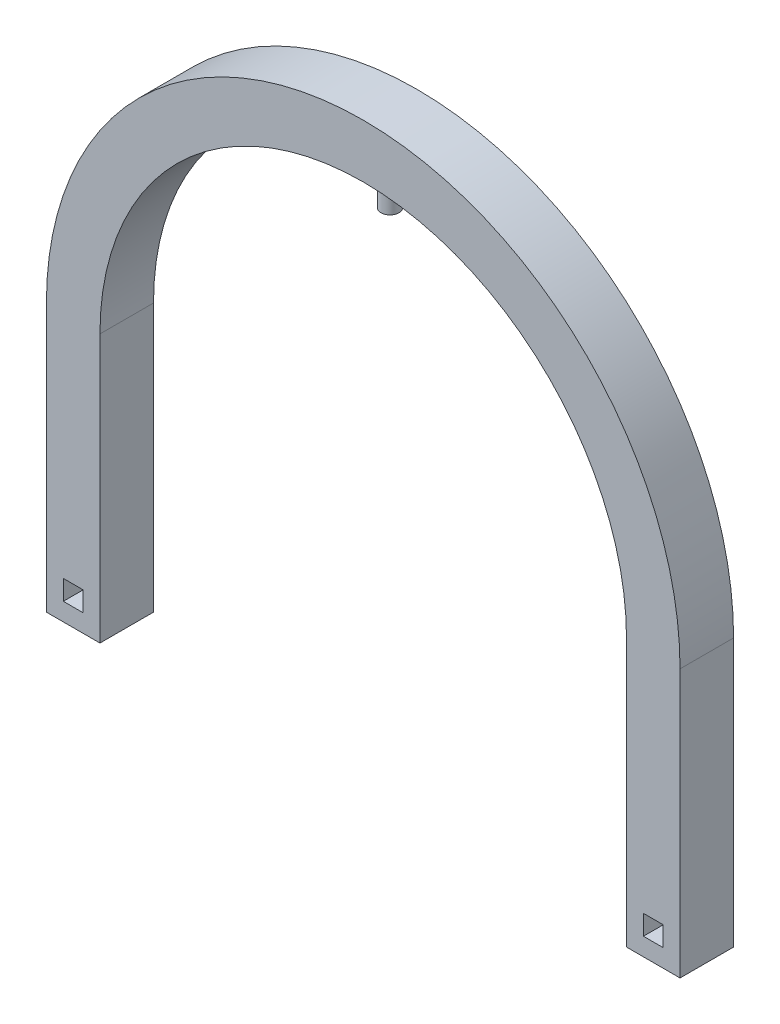
ISO-10303-21;
HEADER;
FILE_DESCRIPTION(('STEP AP214'),'2;1');
FILE_NAME('part.step','',(''),(''),'','','');
FILE_SCHEMA(('AUTOMOTIVE_DESIGN { 1 0 10303 214 1 1 1 1 }'));
ENDSEC;
DATA;
#1=APPLICATION_CONTEXT('core data for automotive mechanical design processes');
#2=APPLICATION_PROTOCOL_DEFINITION('international standard','automotive_design',2000,#1);
#3=PRODUCT_CONTEXT('',#1,'mechanical');
#4=PRODUCT('Part','Part','',(#3));
#5=PRODUCT_RELATED_PRODUCT_CATEGORY('part','',(#4));
#6=PRODUCT_DEFINITION_FORMATION('','',#4);
#7=PRODUCT_DEFINITION_CONTEXT('part definition',#1,'design');
#8=PRODUCT_DEFINITION('design','',#6,#7);
#9=PRODUCT_DEFINITION_SHAPE('','',#8);
#10=(LENGTH_UNIT() NAMED_UNIT(*) SI_UNIT(.MILLI.,.METRE.));
#11=(NAMED_UNIT(*) PLANE_ANGLE_UNIT() SI_UNIT($,.RADIAN.));
#12=(NAMED_UNIT(*) SI_UNIT($,.STERADIAN.) SOLID_ANGLE_UNIT());
#13=UNCERTAINTY_MEASURE_WITH_UNIT(LENGTH_MEASURE(1.E-05),#10,'distance_accuracy_value','');
#14=(GEOMETRIC_REPRESENTATION_CONTEXT(3) GLOBAL_UNCERTAINTY_ASSIGNED_CONTEXT((#13)) GLOBAL_UNIT_ASSIGNED_CONTEXT((#10,
#11,#12)) REPRESENTATION_CONTEXT('',''));
#15=CARTESIAN_POINT('',(0.,0.,0.));
#16=DIRECTION('',(0.,0.,1.));
#17=DIRECTION('',(1.,0.,0.));
#18=AXIS2_PLACEMENT_3D('',#15,#16,#17);
#19=CARTESIAN_POINT('',(-38.1,381.,-38.1));
#20=DIRECTION('',(0.,0.,1.));
#21=DIRECTION('',(1.,0.,0.));
#22=AXIS2_PLACEMENT_3D('',#19,#20,#21);
#23=PLANE('',#22);
#24=DIRECTION('',(-1.,0.,0.));
#25=VECTOR('',#24,1.);
#26=CARTESIAN_POINT('',(-38.1,0.,-38.1));
#27=LINE('',#26,#25);
#28=CARTESIAN_POINT('',(38.1,0.,-38.1));
#29=VERTEX_POINT('',#28);
#30=CARTESIAN_POINT('',(-38.1,0.,-38.1));
#31=VERTEX_POINT('',#30);
#32=EDGE_CURVE('E274',#29,#31,#27,.T.);
#33=ORIENTED_EDGE('',*,*,#32,.T.);
#34=DIRECTION('',(0.,-1.,0.));
#35=VECTOR('',#34,1.);
#36=CARTESIAN_POINT('',(-38.1,381.,-38.1));
#37=LINE('',#36,#35);
#38=CARTESIAN_POINT('',(-38.1,381.,-38.1));
#39=VERTEX_POINT('',#38);
#40=EDGE_CURVE('E281',#39,#31,#37,.T.);
#41=ORIENTED_EDGE('',*,*,#40,.F.);
#42=CARTESIAN_POINT('',(-412.75,381.,-38.1));
#43=DIRECTION('',(0.,0.,-1.));
#44=DIRECTION('',(1.,0.,0.));
#45=AXIS2_PLACEMENT_3D('',#42,#43,#44);
#46=CIRCLE('',#45,374.65);
#47=CARTESIAN_POINT('',(-787.4,381.,-38.1));
#48=VERTEX_POINT('',#47);
#49=EDGE_CURVE('E219',#48,#39,#46,.T.);
#50=ORIENTED_EDGE('',*,*,#49,.F.);
#51=DIRECTION('',(0.,-1.,0.));
#52=VECTOR('',#51,1.);
#53=CARTESIAN_POINT('',(-787.4,381.,-38.1));
#54=LINE('',#53,#52);
#55=CARTESIAN_POINT('',(-787.4,0.,-38.1));
#56=VERTEX_POINT('',#55);
#57=EDGE_CURVE('E197',#48,#56,#54,.T.);
#58=ORIENTED_EDGE('',*,*,#57,.T.);
#59=DIRECTION('',(-1.,0.,0.));
#60=VECTOR('',#59,1.);
#61=CARTESIAN_POINT('',(-863.6,0.,-38.1));
#62=LINE('',#61,#60);
#63=CARTESIAN_POINT('',(-863.6,0.,-38.1));
#64=VERTEX_POINT('',#63);
#65=EDGE_CURVE('E214',#56,#64,#62,.T.);
#66=ORIENTED_EDGE('',*,*,#65,.T.);
#67=DIRECTION('',(0.,-1.,0.));
#68=VECTOR('',#67,1.);
#69=CARTESIAN_POINT('',(-863.6,381.,-38.1));
#70=LINE('',#69,#68);
#71=CARTESIAN_POINT('',(-863.6,381.,-38.1));
#72=VERTEX_POINT('',#71);
#73=EDGE_CURVE('E205',#72,#64,#70,.T.);
#74=ORIENTED_EDGE('',*,*,#73,.F.);
#75=CARTESIAN_POINT('',(-412.75,381.,-38.1));
#76=DIRECTION('',(0.,0.,1.));
#77=DIRECTION('',(1.,0.,0.));
#78=AXIS2_PLACEMENT_3D('',#75,#76,#77);
#79=CIRCLE('',#78,450.85);
#80=CARTESIAN_POINT('',(38.1,381.,-38.1));
#81=VERTEX_POINT('',#80);
#82=EDGE_CURVE('E224',#81,#72,#79,.T.);
#83=ORIENTED_EDGE('',*,*,#82,.F.);
#84=DIRECTION('',(0.,-1.,0.));
#85=VECTOR('',#84,1.);
#86=CARTESIAN_POINT('',(38.1,381.,-38.1));
#87=LINE('',#86,#85);
#88=EDGE_CURVE('E55',#81,#29,#87,.T.);
#89=ORIENTED_EDGE('',*,*,#88,.T.);
#90=EDGE_LOOP('',(#33,#41,#50,#58,#66,#74,#83,#89));
#91=FACE_BOUND('',#90,.T.);
#92=DIRECTION('',(0.,-1.,0.));
#93=VECTOR('',#92,1.);
#94=CARTESIAN_POINT('',(14.0236283067812,0.,-38.1));
#95=LINE('',#94,#93);
#96=CARTESIAN_POINT('',(14.0236283067812,53.645033948252,-38.1));
#97=VERTEX_POINT('',#96);
#98=CARTESIAN_POINT('',(14.0236283067812,25.4,-38.1));
#99=VERTEX_POINT('',#98);
#100=EDGE_CURVE('E248',#97,#99,#95,.T.);
#101=ORIENTED_EDGE('',*,*,#100,.F.);
#102=DIRECTION('',(1.,0.,0.));
#103=VECTOR('',#102,1.);
#104=CARTESIAN_POINT('',(0.,53.645033948252,-38.1));
#105=LINE('',#104,#103);
#106=CARTESIAN_POINT('',(-14.0236283067813,53.645033948252,-38.1));
#107=VERTEX_POINT('',#106);
#108=EDGE_CURVE('E246',#107,#97,#105,.T.);
#109=ORIENTED_EDGE('',*,*,#108,.F.);
#110=DIRECTION('',(0.,-1.,0.));
#111=VECTOR('',#110,1.);
#112=CARTESIAN_POINT('',(-14.0236283067815,0.,-38.1));
#113=LINE('',#112,#111);
#114=CARTESIAN_POINT('',(-14.0236283067814,25.4,-38.1));
#115=VERTEX_POINT('',#114);
#116=EDGE_CURVE('E56',#107,#115,#113,.T.);
#117=ORIENTED_EDGE('',*,*,#116,.T.);
#118=DIRECTION('',(1.,0.,0.));
#119=VECTOR('',#118,1.);
#120=CARTESIAN_POINT('',(0.,25.4,-38.1));
#121=LINE('',#120,#119);
#122=EDGE_CURVE('E251',#115,#99,#121,.T.);
#123=ORIENTED_EDGE('',*,*,#122,.T.);
#124=EDGE_LOOP('',(#101,#109,#117,#123));
#125=FACE_BOUND('',#124,.T.);
#126=DIRECTION('',(0.,-1.,0.));
#127=VECTOR('',#126,1.);
#128=CARTESIAN_POINT('',(-811.476371693219,0.,-38.1));
#129=LINE('',#128,#127);
#130=CARTESIAN_POINT('',(-811.476371693219,53.645033948252,-38.1));
#131=VERTEX_POINT('',#130);
#132=CARTESIAN_POINT('',(-811.476371693219,25.4,-38.1));
#133=VERTEX_POINT('',#132);
#134=EDGE_CURVE('E183',#131,#133,#129,.T.);
#135=ORIENTED_EDGE('',*,*,#134,.F.);
#136=DIRECTION('',(-1.,0.,0.));
#137=VECTOR('',#136,1.);
#138=CARTESIAN_POINT('',(0.,53.645033948252,-38.1));
#139=LINE('',#138,#137);
#140=CARTESIAN_POINT('',(-839.523628306781,53.645033948252,-38.1));
#141=VERTEX_POINT('',#140);
#142=EDGE_CURVE('E186',#131,#141,#139,.T.);
#143=ORIENTED_EDGE('',*,*,#142,.T.);
#144=DIRECTION('',(0.,-1.,0.));
#145=VECTOR('',#144,1.);
#146=CARTESIAN_POINT('',(-839.523628306781,3.29990207684181E-12,-38.1));
#147=LINE('',#146,#145);
#148=CARTESIAN_POINT('',(-839.523628306781,25.4,-38.1));
#149=VERTEX_POINT('',#148);
#150=EDGE_CURVE('E167',#141,#149,#147,.T.);
#151=ORIENTED_EDGE('',*,*,#150,.T.);
#152=DIRECTION('',(-1.,0.,0.));
#153=VECTOR('',#152,1.);
#154=CARTESIAN_POINT('',(0.,25.4,-38.1));
#155=LINE('',#154,#153);
#156=EDGE_CURVE('E193',#133,#149,#155,.T.);
#157=ORIENTED_EDGE('',*,*,#156,.F.);
#158=EDGE_LOOP('',(#135,#143,#151,#157));
#159=FACE_BOUND('',#158,.T.);
#160=ADVANCED_FACE('F39',(#91,#125,#159),#23,.F.);
#161=CARTESIAN_POINT('',(-38.1,381.,38.1));
#162=DIRECTION('',(0.,0.,-1.));
#163=DIRECTION('',(-1.,0.,0.));
#164=AXIS2_PLACEMENT_3D('',#161,#162,#163);
#165=PLANE('',#164);
#166=DIRECTION('',(1.,0.,0.));
#167=VECTOR('',#166,1.);
#168=CARTESIAN_POINT('',(-38.1,0.,38.1));
#169=LINE('',#168,#167);
#170=CARTESIAN_POINT('',(-38.1,0.,38.1));
#171=VERTEX_POINT('',#170);
#172=CARTESIAN_POINT('',(38.1,0.,38.1));
#173=VERTEX_POINT('',#172);
#174=EDGE_CURVE('E267',#171,#173,#169,.T.);
#175=ORIENTED_EDGE('',*,*,#174,.T.);
#176=DIRECTION('',(0.,-1.,0.));
#177=VECTOR('',#176,1.);
#178=CARTESIAN_POINT('',(38.1,381.,38.1));
#179=LINE('',#178,#177);
#180=CARTESIAN_POINT('',(38.1,381.,38.1));
#181=VERTEX_POINT('',#180);
#182=EDGE_CURVE('E275',#181,#173,#179,.T.);
#183=ORIENTED_EDGE('',*,*,#182,.F.);
#184=CARTESIAN_POINT('',(-412.75,381.,38.1));
#185=DIRECTION('',(0.,0.,1.));
#186=DIRECTION('',(1.,0.,0.));
#187=AXIS2_PLACEMENT_3D('',#184,#185,#186);
#188=CIRCLE('',#187,450.85);
#189=CARTESIAN_POINT('',(-863.6,381.,38.1));
#190=VERTEX_POINT('',#189);
#191=EDGE_CURVE('E229',#181,#190,#188,.T.);
#192=ORIENTED_EDGE('',*,*,#191,.T.);
#193=DIRECTION('',(0.,-1.,0.));
#194=VECTOR('',#193,1.);
#195=CARTESIAN_POINT('',(-863.6,381.,38.1));
#196=LINE('',#195,#194);
#197=CARTESIAN_POINT('',(-863.6,0.,38.1));
#198=VERTEX_POINT('',#197);
#199=EDGE_CURVE('E202',#190,#198,#196,.T.);
#200=ORIENTED_EDGE('',*,*,#199,.T.);
#201=DIRECTION('',(1.,0.,0.));
#202=VECTOR('',#201,1.);
#203=CARTESIAN_POINT('',(-863.6,0.,38.1));
#204=LINE('',#203,#202);
#205=CARTESIAN_POINT('',(-787.4,0.,38.1));
#206=VERTEX_POINT('',#205);
#207=EDGE_CURVE('E211',#198,#206,#204,.T.);
#208=ORIENTED_EDGE('',*,*,#207,.T.);
#209=DIRECTION('',(0.,-1.,0.));
#210=VECTOR('',#209,1.);
#211=CARTESIAN_POINT('',(-787.4,381.,38.1));
#212=LINE('',#211,#210);
#213=CARTESIAN_POINT('',(-787.4,381.,38.1));
#214=VERTEX_POINT('',#213);
#215=EDGE_CURVE('E208',#214,#206,#212,.T.);
#216=ORIENTED_EDGE('',*,*,#215,.F.);
#217=CARTESIAN_POINT('',(-412.75,381.,38.1));
#218=DIRECTION('',(0.,0.,-1.));
#219=DIRECTION('',(1.,0.,0.));
#220=AXIS2_PLACEMENT_3D('',#217,#218,#219);
#221=CIRCLE('',#220,374.65);
#222=CARTESIAN_POINT('',(-38.1,381.,38.1));
#223=VERTEX_POINT('',#222);
#224=EDGE_CURVE('E227',#214,#223,#221,.T.);
#225=ORIENTED_EDGE('',*,*,#224,.T.);
#226=DIRECTION('',(0.,-1.,0.));
#227=VECTOR('',#226,1.);
#228=CARTESIAN_POINT('',(-38.1,381.,38.1));
#229=LINE('',#228,#227);
#230=EDGE_CURVE('E285',#223,#171,#229,.T.);
#231=ORIENTED_EDGE('',*,*,#230,.T.);
#232=EDGE_LOOP('',(#175,#183,#192,#200,#208,#216,#225,#231));
#233=FACE_BOUND('',#232,.T.);
#234=DIRECTION('',(0.,-1.,0.));
#235=VECTOR('',#234,1.);
#236=CARTESIAN_POINT('',(14.0236283067812,0.,38.1));
#237=LINE('',#236,#235);
#238=CARTESIAN_POINT('',(14.0236283067812,53.645033948252,38.1));
#239=VERTEX_POINT('',#238);
#240=CARTESIAN_POINT('',(14.0236283067812,25.4,38.1));
#241=VERTEX_POINT('',#240);
#242=EDGE_CURVE('E70',#239,#241,#237,.T.);
#243=ORIENTED_EDGE('',*,*,#242,.T.);
#244=DIRECTION('',(1.,0.,0.));
#245=VECTOR('',#244,1.);
#246=CARTESIAN_POINT('',(0.,25.4,38.1));
#247=LINE('',#246,#245);
#248=CARTESIAN_POINT('',(-14.0236283067814,25.4,38.1));
#249=VERTEX_POINT('',#248);
#250=EDGE_CURVE('E241',#249,#241,#247,.T.);
#251=ORIENTED_EDGE('',*,*,#250,.F.);
#252=DIRECTION('',(0.,-1.,0.));
#253=VECTOR('',#252,1.);
#254=CARTESIAN_POINT('',(-14.0236283067815,0.,38.1));
#255=LINE('',#254,#253);
#256=CARTESIAN_POINT('',(-14.0236283067813,53.645033948252,38.1));
#257=VERTEX_POINT('',#256);
#258=EDGE_CURVE('E245',#257,#249,#255,.T.);
#259=ORIENTED_EDGE('',*,*,#258,.F.);
#260=DIRECTION('',(1.,0.,0.));
#261=VECTOR('',#260,1.);
#262=CARTESIAN_POINT('',(0.,53.645033948252,38.1));
#263=LINE('',#262,#261);
#264=EDGE_CURVE('E239',#257,#239,#263,.T.);
#265=ORIENTED_EDGE('',*,*,#264,.T.);
#266=EDGE_LOOP('',(#243,#251,#259,#265));
#267=FACE_BOUND('',#266,.T.);
#268=DIRECTION('',(0.,-1.,0.));
#269=VECTOR('',#268,1.);
#270=CARTESIAN_POINT('',(-811.476371693219,0.,38.1));
#271=LINE('',#270,#269);
#272=CARTESIAN_POINT('',(-811.476371693219,53.645033948252,38.1));
#273=VERTEX_POINT('',#272);
#274=CARTESIAN_POINT('',(-811.476371693219,25.4,38.1));
#275=VERTEX_POINT('',#274);
#276=EDGE_CURVE('E179',#273,#275,#271,.T.);
#277=ORIENTED_EDGE('',*,*,#276,.T.);
#278=DIRECTION('',(-1.,0.,0.));
#279=VECTOR('',#278,1.);
#280=CARTESIAN_POINT('',(0.,25.4,38.1));
#281=LINE('',#280,#279);
#282=CARTESIAN_POINT('',(-839.523628306781,25.4,38.1));
#283=VERTEX_POINT('',#282);
#284=EDGE_CURVE('E181',#275,#283,#281,.T.);
#285=ORIENTED_EDGE('',*,*,#284,.T.);
#286=DIRECTION('',(0.,-1.,0.));
#287=VECTOR('',#286,1.);
#288=CARTESIAN_POINT('',(-839.523628306781,3.29990207684181E-12,38.1));
#289=LINE('',#288,#287);
#290=CARTESIAN_POINT('',(-839.523628306781,53.645033948252,38.1));
#291=VERTEX_POINT('',#290);
#292=EDGE_CURVE('E162',#291,#283,#289,.T.);
#293=ORIENTED_EDGE('',*,*,#292,.F.);
#294=DIRECTION('',(-1.,0.,0.));
#295=VECTOR('',#294,1.);
#296=CARTESIAN_POINT('',(0.,53.645033948252,38.1));
#297=LINE('',#296,#295);
#298=EDGE_CURVE('E171',#273,#291,#297,.T.);
#299=ORIENTED_EDGE('',*,*,#298,.F.);
#300=EDGE_LOOP('',(#277,#285,#293,#299));
#301=FACE_BOUND('',#300,.T.);
#302=ADVANCED_FACE('F182',(#233,#267,#301),#165,.F.);
#303=CARTESIAN_POINT('',(38.1,381.,-38.1));
#304=DIRECTION('',(-1.,0.,0.));
#305=DIRECTION('',(0.,0.,1.));
#306=AXIS2_PLACEMENT_3D('',#303,#304,#305);
#307=PLANE('',#306);
#308=DIRECTION('',(0.,0.,-1.));
#309=VECTOR('',#308,1.);
#310=CARTESIAN_POINT('',(38.1,0.,-38.1));
#311=LINE('',#310,#309);
#312=EDGE_CURVE('E259',#173,#29,#311,.T.);
#313=ORIENTED_EDGE('',*,*,#312,.T.);
#314=ORIENTED_EDGE('',*,*,#88,.F.);
#315=DIRECTION('',(0.,0.,-1.));
#316=VECTOR('',#315,1.);
#317=CARTESIAN_POINT('',(38.1,381.,-38.1));
#318=LINE('',#317,#316);
#319=EDGE_CURVE('E264',#181,#81,#318,.T.);
#320=ORIENTED_EDGE('',*,*,#319,.F.);
#321=ORIENTED_EDGE('',*,*,#182,.T.);
#322=EDGE_LOOP('',(#313,#314,#320,#321));
#323=FACE_BOUND('',#322,.T.);
#324=ADVANCED_FACE('F41',(#323),#307,.F.);
#325=CARTESIAN_POINT('',(-38.1,381.,-38.1));
#326=DIRECTION('',(1.,0.,0.));
#327=DIRECTION('',(0.,0.,-1.));
#328=AXIS2_PLACEMENT_3D('',#325,#326,#327);
#329=PLANE('',#328);
#330=DIRECTION('',(0.,0.,1.));
#331=VECTOR('',#330,1.);
#332=CARTESIAN_POINT('',(-38.1,0.,-38.1));
#333=LINE('',#332,#331);
#334=EDGE_CURVE('E280',#31,#171,#333,.T.);
#335=ORIENTED_EDGE('',*,*,#334,.T.);
#336=ORIENTED_EDGE('',*,*,#230,.F.);
#337=DIRECTION('',(0.,0.,1.));
#338=VECTOR('',#337,1.);
#339=CARTESIAN_POINT('',(-38.1,381.,-38.1));
#340=LINE('',#339,#338);
#341=EDGE_CURVE('E268',#39,#223,#340,.T.);
#342=ORIENTED_EDGE('',*,*,#341,.F.);
#343=ORIENTED_EDGE('',*,*,#40,.T.);
#344=EDGE_LOOP('',(#335,#336,#342,#343));
#345=FACE_BOUND('',#344,.T.);
#346=ADVANCED_FACE('F299',(#345),#329,.F.);
#347=CARTESIAN_POINT('',(0.,0.,0.));
#348=DIRECTION('',(0.,1.,0.));
#349=DIRECTION('',(0.,0.,1.));
#350=AXIS2_PLACEMENT_3D('',#347,#348,#349);
#351=PLANE('',#350);
#352=ORIENTED_EDGE('',*,*,#312,.F.);
#353=ORIENTED_EDGE('',*,*,#174,.F.);
#354=ORIENTED_EDGE('',*,*,#334,.F.);
#355=ORIENTED_EDGE('',*,*,#32,.F.);
#356=EDGE_LOOP('',(#352,#353,#354,#355));
#357=FACE_BOUND('',#356,.T.);
#358=ADVANCED_FACE('F297',(#357),#351,.F.);
#359=CARTESIAN_POINT('',(14.0236283067812,0.,-38.1));
#360=DIRECTION('',(-1.,0.,0.));
#361=DIRECTION('',(0.,-1.,0.));
#362=AXIS2_PLACEMENT_3D('',#359,#360,#361);
#363=PLANE('',#362);
#364=DIRECTION('',(0.,0.,1.));
#365=VECTOR('',#364,1.);
#366=CARTESIAN_POINT('',(14.0236283067812,53.645033948252,-38.1));
#367=LINE('',#366,#365);
#368=EDGE_CURVE('E258',#97,#239,#367,.T.);
#369=ORIENTED_EDGE('',*,*,#368,.F.);
#370=ORIENTED_EDGE('',*,*,#100,.T.);
#371=DIRECTION('',(0.,0.,1.));
#372=VECTOR('',#371,1.);
#373=CARTESIAN_POINT('',(14.0236283067812,25.4,-38.1));
#374=LINE('',#373,#372);
#375=EDGE_CURVE('E260',#99,#241,#374,.T.);
#376=ORIENTED_EDGE('',*,*,#375,.T.);
#377=ORIENTED_EDGE('',*,*,#242,.F.);
#378=EDGE_LOOP('',(#369,#370,#376,#377));
#379=FACE_BOUND('',#378,.T.);
#380=ADVANCED_FACE('F345',(#379),#363,.T.);
#381=CARTESIAN_POINT('',(0.,25.4,-38.1));
#382=DIRECTION('',(0.,-1.,0.));
#383=DIRECTION('',(0.,0.,-1.));
#384=AXIS2_PLACEMENT_3D('',#381,#382,#383);
#385=PLANE('',#384);
#386=ORIENTED_EDGE('',*,*,#375,.F.);
#387=ORIENTED_EDGE('',*,*,#122,.F.);
#388=DIRECTION('',(0.,0.,1.));
#389=VECTOR('',#388,1.);
#390=CARTESIAN_POINT('',(-14.0236283067814,25.4,-38.1));
#391=LINE('',#390,#389);
#392=EDGE_CURVE('E257',#115,#249,#391,.T.);
#393=ORIENTED_EDGE('',*,*,#392,.T.);
#394=ORIENTED_EDGE('',*,*,#250,.T.);
#395=EDGE_LOOP('',(#386,#387,#393,#394));
#396=FACE_BOUND('',#395,.T.);
#397=ADVANCED_FACE('F341',(#396),#385,.F.);
#398=CARTESIAN_POINT('',(-14.0236283067815,0.,-38.1));
#399=DIRECTION('',(-1.,0.,0.));
#400=DIRECTION('',(0.,-1.,0.));
#401=AXIS2_PLACEMENT_3D('',#398,#399,#400);
#402=PLANE('',#401);
#403=ORIENTED_EDGE('',*,*,#392,.F.);
#404=ORIENTED_EDGE('',*,*,#116,.F.);
#405=DIRECTION('',(0.,0.,1.));
#406=VECTOR('',#405,1.);
#407=CARTESIAN_POINT('',(-14.0236283067813,53.645033948252,-38.1));
#408=LINE('',#407,#406);
#409=EDGE_CURVE('E265',#107,#257,#408,.T.);
#410=ORIENTED_EDGE('',*,*,#409,.T.);
#411=ORIENTED_EDGE('',*,*,#258,.T.);
#412=EDGE_LOOP('',(#403,#404,#410,#411));
#413=FACE_BOUND('',#412,.T.);
#414=ADVANCED_FACE('F350',(#413),#402,.F.);
#415=CARTESIAN_POINT('',(0.,53.645033948252,-38.1));
#416=DIRECTION('',(0.,-1.,0.));
#417=DIRECTION('',(0.,0.,-1.));
#418=AXIS2_PLACEMENT_3D('',#415,#416,#417);
#419=PLANE('',#418);
#420=ORIENTED_EDGE('',*,*,#409,.F.);
#421=ORIENTED_EDGE('',*,*,#108,.T.);
#422=ORIENTED_EDGE('',*,*,#368,.T.);
#423=ORIENTED_EDGE('',*,*,#264,.F.);
#424=EDGE_LOOP('',(#420,#421,#422,#423));
#425=FACE_BOUND('',#424,.T.);
#426=ADVANCED_FACE('F328',(#425),#419,.T.);
#427=CARTESIAN_POINT('',(-412.75,381.,38.1));
#428=DIRECTION('',(0.,0.,-1.));
#429=DIRECTION('',(-1.,0.,0.));
#430=AXIS2_PLACEMENT_3D('',#427,#428,#429);
#431=CYLINDRICAL_SURFACE('',#430,374.65);
#432=CARTESIAN_POINT('',(-412.75,755.65,12.7));
#433=CARTESIAN_POINT('',(-412.393299475952,755.65000025061,12.700002662333));
#434=CARTESIAN_POINT('',(-412.036642271957,755.649489514971,12.6849660908148));
#435=CARTESIAN_POINT('',(-411.325745418778,755.64746137539,12.624925525055));
#436=CARTESIAN_POINT('',(-410.971506423443,755.645943709296,12.5799137267819));
#437=CARTESIAN_POINT('',(-410.267710906672,755.641942040486,12.4601687653098));
#438=CARTESIAN_POINT('',(-409.91815977847,755.639457009526,12.3854039747763));
#439=CARTESIAN_POINT('',(-409.226607277578,755.633591360847,12.2066885394474));
#440=CARTESIAN_POINT('',(-408.884605879433,755.630210746148,12.1027379930684));
#441=CARTESIAN_POINT('',(-408.210755193753,755.622651807293,11.8664514913539));
#442=CARTESIAN_POINT('',(-407.878900920771,755.61847388242,11.7341297398772));
#443=CARTESIAN_POINT('',(-407.227517557172,755.609437679306,11.4420102136263));
#444=CARTESIAN_POINT('',(-406.907988658907,755.604579390453,11.2822120102616));
#445=CARTESIAN_POINT('',(-406.283608349066,755.594321580315,10.9363211500011));
#446=CARTESIAN_POINT('',(-405.978753293861,755.588922194425,10.7502350662198));
#447=CARTESIAN_POINT('',(-405.385798848043,755.577734240478,10.3530612130602));
#448=CARTESIAN_POINT('',(-405.097699397935,755.571945673802,10.1419735324644));
#449=CARTESIAN_POINT('',(-404.540168392811,755.560140651307,9.69619074257972));
#450=CARTESIAN_POINT('',(-404.270745579827,755.554124090781,9.46148470251019));
#451=CARTESIAN_POINT('',(-403.752627146958,755.542036291286,8.97021351423393));
#452=CARTESIAN_POINT('',(-403.503931552589,755.535965052251,8.71364833911908));
#453=CARTESIAN_POINT('',(-403.029024099977,755.523939914872,8.18046983031033));
#454=CARTESIAN_POINT('',(-402.802813132713,755.517986021186,7.90385570290473));
#455=CARTESIAN_POINT('',(-402.37449305845,755.506364795498,7.33255189049581));
#456=CARTESIAN_POINT('',(-402.172383948301,755.500697463458,7.03786220785464));
#457=CARTESIAN_POINT('',(-401.793661861312,755.489809029739,6.43243166171649));
#458=CARTESIAN_POINT('',(-401.617054587104,755.484588027973,6.12168722914129));
#459=CARTESIAN_POINT('',(-401.290646855691,755.474742006645,5.48641536784238));
#460=CARTESIAN_POINT('',(-401.140846404648,755.470116987221,5.16188793595092));
#461=CARTESIAN_POINT('',(-400.869120071149,755.461594402824,4.50135815590893));
#462=CARTESIAN_POINT('',(-400.747194077762,755.457696834957,4.16535585343091));
#463=CARTESIAN_POINT('',(-400.53208534521,755.450739954703,3.48426470771503));
#464=CARTESIAN_POINT('',(-400.438902594306,755.447680641973,3.13917586818843));
#465=CARTESIAN_POINT('',(-400.281975722384,755.442488293765,2.44250207153813));
#466=CARTESIAN_POINT('',(-400.218220210119,755.440354899883,2.0909196829637));
#467=CARTESIAN_POINT('',(-400.120549550119,755.437073317062,1.38362961467131));
#468=CARTESIAN_POINT('',(-400.086634395453,755.435925127894,1.02792193591146));
#469=CARTESIAN_POINT('',(-400.048886651476,755.434646605474,0.314913660583718));
#470=CARTESIAN_POINT('',(-400.045053933562,755.434516267871,-0.0423869291678427));
#471=CARTESIAN_POINT('',(-400.067498097242,755.435277144585,-0.756040031392013));
#472=CARTESIAN_POINT('',(-400.09377497225,755.436168358678,-1.11239254407197));
#473=CARTESIAN_POINT('',(-400.176233662464,755.438946420623,-1.82146766547115));
#474=CARTESIAN_POINT('',(-400.232403147642,755.440832857964,-2.17419170974972));
#475=CARTESIAN_POINT('',(-400.374238820585,755.445547526874,-2.8736519785981));
#476=CARTESIAN_POINT('',(-400.459904998978,755.448375758143,-3.22038820507048));
#477=CARTESIAN_POINT('',(-400.660123762579,755.454893698687,-3.9054101651255));
#478=CARTESIAN_POINT('',(-400.774676407473,755.458583409742,-4.24369588124571));
#479=CARTESIAN_POINT('',(-401.031852336577,755.466719554343,-4.9094139642366));
#480=CARTESIAN_POINT('',(-401.174475629569,755.471165988127,-5.23684632771153));
#481=CARTESIAN_POINT('',(-401.486810712279,755.480690380783,-5.87860051199997));
#482=CARTESIAN_POINT('',(-401.656528130976,755.485768470838,-6.19291959129049));
#483=CARTESIAN_POINT('',(-402.021823441733,755.496411330469,-6.80614421791154));
#484=CARTESIAN_POINT('',(-402.217401336138,755.50197610009,-7.10504976384471));
#485=CARTESIAN_POINT('',(-402.633028680667,755.513434462346,-7.68532749669677));
#486=CARTESIAN_POINT('',(-402.853078192074,755.519328055805,-7.96669963970579));
#487=CARTESIAN_POINT('',(-403.316086222185,755.531276907277,-8.50991395523735));
#488=CARTESIAN_POINT('',(-403.559044749004,755.537332165346,-8.77175612084219));
#489=CARTESIAN_POINT('',(-404.066274819356,755.549435705683,-9.27417969581749));
#490=CARTESIAN_POINT('',(-404.330557045211,755.555483982894,-9.51475032092902));
#491=CARTESIAN_POINT('',(-404.878451415093,755.567398857201,-9.97277375611922));
#492=CARTESIAN_POINT('',(-405.162063566065,755.57326545423,-10.1902265578924));
#493=CARTESIAN_POINT('',(-405.746604073456,755.584650488863,-10.6004689558711));
#494=CARTESIAN_POINT('',(-406.04753243671,755.590168926329,-10.7932585423389));
#495=CARTESIAN_POINT('',(-406.664568057641,755.600701030209,-11.1528032053514));
#496=CARTESIAN_POINT('',(-406.980675312941,755.605714696703,-11.3195582859699));
#497=CARTESIAN_POINT('',(-407.625827252142,755.615095020723,-11.6258489589556));
#498=CARTESIAN_POINT('',(-407.95487210703,755.619461669694,-11.7653841914314));
#499=CARTESIAN_POINT('',(-408.623556442676,755.627423917999,-12.0162381850442));
#500=CARTESIAN_POINT('',(-408.963195924137,755.631019517282,-12.1275569443081));
#501=CARTESIAN_POINT('',(-409.650653007351,755.637337564157,-12.3211837893501));
#502=CARTESIAN_POINT('',(-409.998470585865,755.64006001423,-12.4034919575488));
#503=CARTESIAN_POINT('',(-410.699809837443,755.644554460875,-12.5385105504057));
#504=CARTESIAN_POINT('',(-411.053331508088,755.646326457852,-12.5912209876109));
#505=CARTESIAN_POINT('',(-411.763385675627,755.648869038131,-12.6666489415678));
#506=CARTESIAN_POINT('',(-412.119916586553,755.649640119373,-12.6893813719441));
#507=CARTESIAN_POINT('',(-412.833626958875,755.650160618184,-12.7047397064325));
#508=CARTESIAN_POINT('',(-413.190806420057,755.64991003609,-12.6973656204735));
#509=CARTESIAN_POINT('',(-413.903272742567,755.648394320477,-12.6525636027666));
#510=CARTESIAN_POINT('',(-414.258559606621,755.647129188422,-12.6151357143317));
#511=CARTESIAN_POINT('',(-414.964714437143,755.643620274292,-12.5104932408811));
#512=CARTESIAN_POINT('',(-415.31558240374,755.641376492248,-12.4432786567388));
#513=CARTESIAN_POINT('',(-416.010324177646,755.635974568431,-12.2795612390285));
#514=CARTESIAN_POINT('',(-416.354199587599,755.632816638762,-12.1830651991625));
#515=CARTESIAN_POINT('',(-417.032597360503,755.625675761491,-11.9614669747979));
#516=CARTESIAN_POINT('',(-417.36711972543,755.621692814064,-11.8363647963432));
#517=CARTESIAN_POINT('',(-418.024437134236,755.613014806324,-11.5584445188015));
#518=CARTESIAN_POINT('',(-418.347232154683,755.608319744589,-11.4056263643397));
#519=CARTESIAN_POINT('',(-418.978803721018,755.598350591085,-11.0733610565079));
#520=CARTESIAN_POINT('',(-419.28758026117,755.593076499081,-10.8939138922424));
#521=CARTESIAN_POINT('',(-419.889043620963,755.582096580763,-10.5095895407597));
#522=CARTESIAN_POINT('',(-420.181724031784,755.576390584601,-10.3047023286252));
#523=CARTESIAN_POINT('',(-420.748786376489,755.564710509539,-9.8710095185482));
#524=CARTESIAN_POINT('',(-421.023168306042,755.558736430576,-9.64220391494656));
#525=CARTESIAN_POINT('',(-421.55168745602,755.54668959506,-9.16229822429625));
#526=CARTESIAN_POINT('',(-421.805824618982,755.540616838227,-8.91119807397107));
#527=CARTESIAN_POINT('',(-422.292049791996,755.528544900123,-8.38848595185593));
#528=CARTESIAN_POINT('',(-422.524137797395,755.522545718867,-8.11687397573698));
#529=CARTESIAN_POINT('',(-422.964706488134,755.510788722366,-7.55495119396926));
#530=CARTESIAN_POINT('',(-423.173177535854,755.505031006259,-7.26463282988047));
#531=CARTESIAN_POINT('',(-423.564921192717,755.493923040005,-6.66745826928691));
#532=CARTESIAN_POINT('',(-423.748193793921,755.488572789987,-6.36060206757212));
#533=CARTESIAN_POINT('',(-424.088236044439,755.478431758726,-5.73253243412031));
#534=CARTESIAN_POINT('',(-424.245005749975,755.473640976296,-5.41131903284208));
#535=CARTESIAN_POINT('',(-424.530926095335,755.464755019487,-4.75681731225652));
#536=CARTESIAN_POINT('',(-424.660076743986,755.460659844885,-4.42352899680835));
#537=CARTESIAN_POINT('',(-424.889813351923,755.453282331631,-3.74732079869896));
#538=CARTESIAN_POINT('',(-424.990405513144,755.449999816517,-3.4044030250331));
#539=CARTESIAN_POINT('',(-425.162345118198,755.444339784412,-2.71130513582853));
#540=CARTESIAN_POINT('',(-425.233692564862,755.441962267334,-2.36112502099287));
#541=CARTESIAN_POINT('',(-425.346633450739,755.438179843374,-1.65599421437406));
#542=CARTESIAN_POINT('',(-425.388226922791,755.436774935419,-1.30104352785629));
#543=CARTESIAN_POINT('',(-425.441362951759,755.434977687678,-0.588897420181168));
#544=CARTESIAN_POINT('',(-425.452905519202,755.434585347538,-0.231701999810224));
#545=CARTESIAN_POINT('',(-425.445859121658,755.434824332628,0.482210982494704));
#546=CARTESIAN_POINT('',(-425.427285336236,755.43545514216,0.838928694521134));
#547=CARTESIAN_POINT('',(-425.360167382216,755.437721527305,1.54953001604325));
#548=CARTESIAN_POINT('',(-425.311623224344,755.439357102558,1.90341362655306));
#549=CARTESIAN_POINT('',(-425.184910691733,755.443586549423,2.60583156332239));
#550=CARTESIAN_POINT('',(-425.106742265118,755.446180422714,2.95436588021346));
#551=CARTESIAN_POINT('',(-424.921338458533,755.452252781694,3.64360774917239));
#552=CARTESIAN_POINT('',(-424.814103074315,755.455731267513,3.98431530009645));
#553=CARTESIAN_POINT('',(-424.571327408457,755.463474128271,4.65548855489371));
#554=CARTESIAN_POINT('',(-424.435786698426,755.467738515103,4.98595410367101));
#555=CARTESIAN_POINT('',(-424.13736602369,755.476932087115,5.63429181918395));
#556=CARTESIAN_POINT('',(-423.974486055314,755.481861272384,5.95216398422817));
#557=CARTESIAN_POINT('',(-423.622551305434,755.492244381969,6.57304818474775));
#558=CARTESIAN_POINT('',(-423.433497455631,755.497698287605,6.87606074865348));
#559=CARTESIAN_POINT('',(-423.030553671961,755.508976289012,7.46508844936038));
#560=CARTESIAN_POINT('',(-422.81666375253,755.51480038457,7.75110359604039));
#561=CARTESIAN_POINT('',(-422.365476678159,755.526655976866,8.30421789206519));
#562=CARTESIAN_POINT('',(-422.128170303169,755.532687554685,8.57130951873475));
#563=CARTESIAN_POINT('',(-421.631904960249,755.544784841445,9.08455781692115));
#564=CARTESIAN_POINT('',(-421.372945901257,755.550850550529,9.33071440038506));
#565=CARTESIAN_POINT('',(-420.83514560638,755.562845545202,9.80040365843364));
#566=CARTESIAN_POINT('',(-420.556299344187,755.568774795799,10.0239305787931));
#567=CARTESIAN_POINT('',(-419.980767491978,755.580326932934,10.446697671574));
#568=CARTESIAN_POINT('',(-419.684082180647,755.585949824256,10.6459382232528));
#569=CARTESIAN_POINT('',(-419.074759889192,755.596733576119,11.0188513447985));
#570=CARTESIAN_POINT('',(-418.762111830092,755.601894108722,11.1925058226429));
#571=CARTESIAN_POINT('',(-418.12328138692,755.611602046613,11.5128420340638));
#572=CARTESIAN_POINT('',(-417.797098956914,755.616149449819,11.6595236760892));
#573=CARTESIAN_POINT('',(-417.133868884974,755.624497369643,11.9247262746108));
#574=CARTESIAN_POINT('',(-416.796833215795,755.628298678536,12.0432771313582));
#575=CARTESIAN_POINT('',(-416.114079308978,755.635051803478,12.2515448589762));
#576=CARTESIAN_POINT('',(-415.768363361166,755.638003841055,12.3412692497632));
#577=CARTESIAN_POINT('',(-414.981252680328,755.643611711381,12.5104878754928));
#578=CARTESIAN_POINT('',(-414.538005511583,755.645998595802,12.5814937282454));
#579=CARTESIAN_POINT('',(-413.646482761516,755.649192582362,12.6762481088942));
#580=CARTESIAN_POINT('',(-413.198207182097,755.649999685099,12.6999966546817));
#581=CARTESIAN_POINT('',(-412.75,755.65,12.7));
#582=B_SPLINE_CURVE_WITH_KNOTS('',3,(#432,#433,#434,#435,#436,#437,#438,#439,#440,#441,#442,
#443,#444,#445,#446,#447,#448,#449,#450,#451,#452,#453,#454,#455,#456,#457,#458,#459,#460,#461,
#462,#463,#464,#465,#466,#467,#468,#469,#470,#471,#472,#473,#474,#475,#476,#477,#478,#479,#480,
#481,#482,#483,#484,#485,#486,#487,#488,#489,#490,#491,#492,#493,#494,#495,#496,#497,#498,#499,
#500,#501,#502,#503,#504,#505,#506,#507,#508,#509,#510,#511,#512,#513,#514,#515,#516,#517,#518,
#519,#520,#521,#522,#523,#524,#525,#526,#527,#528,#529,#530,#531,#532,#533,#534,#535,#536,#537,
#538,#539,#540,#541,#542,#543,#544,#545,#546,#547,#548,#549,#550,#551,#552,#553,#554,#555,#556,
#557,#558,#559,#560,#561,#562,#563,#564,#565,#566,#567,#568,#569,#570,#571,#572,#573,#574,#575,
#576,#577,#578,#579,#580,#581),.UNSPECIFIED.,.T.,.F.,(4,2,2,2,2,2,2,2,2,2,2,2,2,2,2,2,2,2,2,2,2,
2,2,2,2,2,2,2,2,2,2,2,2,2,2,2,2,2,2,2,2,2,2,2,2,2,2,2,2,2,2,2,2,2,2,2,2,2,2,2,2,2,2,2,2,2,2,2,2,
2,2,2,2,2,4),(0.,1.06971001502453,2.13969863732418,3.2108277052909,4.28195316137649,
5.35254361242294,6.42315076455007,7.49349069055514,8.56382681581715,9.63466060023282,
10.7054957028409,11.7763732215838,12.8472506003826,13.9183670754004,14.9894837965952,
16.0605962550067,17.1317082759461,18.2024053223031,19.2731021199907,20.3437943403826,
21.4144863265891,22.4847370183654,23.5549873700723,24.6252399331983,25.6954928311773,
26.7659683711749,27.8364440082191,28.9069223260073,29.9774010229677,31.0484193568539,
32.1194380755187,33.1904572170451,34.2614761909818,35.3325093246003,36.4035425293118,
37.4745726911319,38.5456023989241,39.6160990836784,40.6865954153904,41.7570902043284,
42.8275849618762,43.897831539516,44.9680778910368,46.038326380866,47.1085753085952,
48.179247325615,49.2499195959617,50.320594905194,51.391270440391,52.4623813354254,
53.5334925679011,54.6046015281226,55.6757101460199,56.7465859771559,57.8174617046227,
58.8883362502399,59.9592104207178,61.0295450056054,62.0998792074799,63.1702152836637,
64.2405515162654,65.3109039491889,66.3812565258699,67.4515710115157,68.5218848750931,
69.592621861036,70.6633633502835,71.734376425271,72.805372773115,73.8771228296082,
74.9488765237633,76.0194858948849,77.0898157505625,78.4339457999699,79.7780753404981),.UNSPECIFIED.);
#583=CARTESIAN_POINT('',(-412.75,755.65,12.7));
#584=VERTEX_POINT('',#583);
#585=EDGE_CURVE('E11',#584,#584,#582,.T.);
#586=ORIENTED_EDGE('',*,*,#585,.T.);
#587=EDGE_LOOP('',(#586));
#588=FACE_BOUND('',#587,.T.);
#589=DIRECTION('',(0.,0.,-1.));
#590=VECTOR('',#589,1.);
#591=CARTESIAN_POINT('',(-787.4,381.,38.1));
#592=LINE('',#591,#590);
#593=EDGE_CURVE('E235',#214,#48,#592,.T.);
#594=ORIENTED_EDGE('',*,*,#593,.T.);
#595=ORIENTED_EDGE('',*,*,#49,.T.);
#596=ORIENTED_EDGE('',*,*,#341,.T.);
#597=ORIENTED_EDGE('',*,*,#224,.F.);
#598=EDGE_LOOP('',(#594,#595,#596,#597));
#599=FACE_BOUND('',#598,.T.);
#600=ADVANCED_FACE('F308',(#588,#599),#431,.F.);
#601=CARTESIAN_POINT('',(-412.75,381.,38.1));
#602=DIRECTION('',(0.,0.,-1.));
#603=DIRECTION('',(-1.,0.,0.));
#604=AXIS2_PLACEMENT_3D('',#601,#602,#603);
#605=CYLINDRICAL_SURFACE('',#604,450.85);
#606=ORIENTED_EDGE('',*,*,#319,.T.);
#607=ORIENTED_EDGE('',*,*,#82,.T.);
#608=DIRECTION('',(0.,0.,-1.));
#609=VECTOR('',#608,1.);
#610=CARTESIAN_POINT('',(-863.6,381.,38.1));
#611=LINE('',#610,#609);
#612=EDGE_CURVE('E231',#190,#72,#611,.T.);
#613=ORIENTED_EDGE('',*,*,#612,.F.);
#614=ORIENTED_EDGE('',*,*,#191,.F.);
#615=EDGE_LOOP('',(#606,#607,#613,#614));
#616=FACE_BOUND('',#615,.T.);
#617=ADVANCED_FACE('F319',(#616),#605,.T.);
#618=CARTESIAN_POINT('',(-787.4,381.,-38.1));
#619=DIRECTION('',(-1.,0.,0.));
#620=DIRECTION('',(0.,0.,1.));
#621=AXIS2_PLACEMENT_3D('',#618,#619,#620);
#622=PLANE('',#621);
#623=DIRECTION('',(0.,0.,-1.));
#624=VECTOR('',#623,1.);
#625=CARTESIAN_POINT('',(-787.4,0.,-38.1));
#626=LINE('',#625,#624);
#627=EDGE_CURVE('E220',#206,#56,#626,.T.);
#628=ORIENTED_EDGE('',*,*,#627,.T.);
#629=ORIENTED_EDGE('',*,*,#57,.F.);
#630=ORIENTED_EDGE('',*,*,#593,.F.);
#631=ORIENTED_EDGE('',*,*,#215,.T.);
#632=EDGE_LOOP('',(#628,#629,#630,#631));
#633=FACE_BOUND('',#632,.T.);
#634=ADVANCED_FACE('F309',(#633),#622,.F.);
#635=CARTESIAN_POINT('',(-863.6,381.,-38.1));
#636=DIRECTION('',(1.,0.,0.));
#637=DIRECTION('',(0.,0.,-1.));
#638=AXIS2_PLACEMENT_3D('',#635,#636,#637);
#639=PLANE('',#638);
#640=DIRECTION('',(0.,0.,1.));
#641=VECTOR('',#640,1.);
#642=CARTESIAN_POINT('',(-863.6,0.,-38.1));
#643=LINE('',#642,#641);
#644=EDGE_CURVE('E213',#64,#198,#643,.T.);
#645=ORIENTED_EDGE('',*,*,#644,.T.);
#646=ORIENTED_EDGE('',*,*,#199,.F.);
#647=ORIENTED_EDGE('',*,*,#612,.T.);
#648=ORIENTED_EDGE('',*,*,#73,.T.);
#649=EDGE_LOOP('',(#645,#646,#647,#648));
#650=FACE_BOUND('',#649,.T.);
#651=ADVANCED_FACE('F316',(#650),#639,.F.);
#652=CARTESIAN_POINT('',(0.,0.,0.));
#653=DIRECTION('',(0.,1.,0.));
#654=DIRECTION('',(0.,0.,1.));
#655=AXIS2_PLACEMENT_3D('',#652,#653,#654);
#656=PLANE('',#655);
#657=ORIENTED_EDGE('',*,*,#627,.F.);
#658=ORIENTED_EDGE('',*,*,#207,.F.);
#659=ORIENTED_EDGE('',*,*,#644,.F.);
#660=ORIENTED_EDGE('',*,*,#65,.F.);
#661=EDGE_LOOP('',(#657,#658,#659,#660));
#662=FACE_BOUND('',#661,.T.);
#663=ADVANCED_FACE('F311',(#662),#656,.F.);
#664=CARTESIAN_POINT('',(-811.476371693219,0.,-38.1));
#665=DIRECTION('',(-1.,0.,0.));
#666=DIRECTION('',(0.,0.,1.));
#667=AXIS2_PLACEMENT_3D('',#664,#665,#666);
#668=PLANE('',#667);
#669=DIRECTION('',(0.,0.,1.));
#670=VECTOR('',#669,1.);
#671=CARTESIAN_POINT('',(-811.476371693219,53.645033948252,-38.1));
#672=LINE('',#671,#670);
#673=EDGE_CURVE('E172',#131,#273,#672,.T.);
#674=ORIENTED_EDGE('',*,*,#673,.F.);
#675=ORIENTED_EDGE('',*,*,#134,.T.);
#676=DIRECTION('',(0.,0.,1.));
#677=VECTOR('',#676,1.);
#678=CARTESIAN_POINT('',(-811.476371693219,25.4,-38.1));
#679=LINE('',#678,#677);
#680=EDGE_CURVE('E191',#133,#275,#679,.T.);
#681=ORIENTED_EDGE('',*,*,#680,.T.);
#682=ORIENTED_EDGE('',*,*,#276,.F.);
#683=EDGE_LOOP('',(#674,#675,#681,#682));
#684=FACE_BOUND('',#683,.T.);
#685=ADVANCED_FACE('F366',(#684),#668,.T.);
#686=CARTESIAN_POINT('',(0.,25.4,-38.1));
#687=DIRECTION('',(0.,1.,0.));
#688=DIRECTION('',(0.,0.,1.));
#689=AXIS2_PLACEMENT_3D('',#686,#687,#688);
#690=PLANE('',#689);
#691=ORIENTED_EDGE('',*,*,#680,.F.);
#692=ORIENTED_EDGE('',*,*,#156,.T.);
#693=DIRECTION('',(0.,0.,1.));
#694=VECTOR('',#693,1.);
#695=CARTESIAN_POINT('',(-839.523628306781,25.4,-38.1));
#696=LINE('',#695,#694);
#697=EDGE_CURVE('E168',#149,#283,#696,.T.);
#698=ORIENTED_EDGE('',*,*,#697,.T.);
#699=ORIENTED_EDGE('',*,*,#284,.F.);
#700=EDGE_LOOP('',(#691,#692,#698,#699));
#701=FACE_BOUND('',#700,.T.);
#702=ADVANCED_FACE('F367',(#701),#690,.T.);
#703=CARTESIAN_POINT('',(-839.523628306781,3.29990207684181E-12,-38.1));
#704=DIRECTION('',(-1.,0.,0.));
#705=DIRECTION('',(0.,-1.,0.));
#706=AXIS2_PLACEMENT_3D('',#703,#704,#705);
#707=PLANE('',#706);
#708=ORIENTED_EDGE('',*,*,#697,.F.);
#709=ORIENTED_EDGE('',*,*,#150,.F.);
#710=DIRECTION('',(0.,0.,1.));
#711=VECTOR('',#710,1.);
#712=CARTESIAN_POINT('',(-839.523628306781,53.645033948252,-38.1));
#713=LINE('',#712,#711);
#714=EDGE_CURVE('E158',#141,#291,#713,.T.);
#715=ORIENTED_EDGE('',*,*,#714,.T.);
#716=ORIENTED_EDGE('',*,*,#292,.T.);
#717=EDGE_LOOP('',(#708,#709,#715,#716));
#718=FACE_BOUND('',#717,.T.);
#719=ADVANCED_FACE('F161',(#718),#707,.F.);
#720=CARTESIAN_POINT('',(0.,53.645033948252,-38.1));
#721=DIRECTION('',(0.,1.,0.));
#722=DIRECTION('',(0.,0.,1.));
#723=AXIS2_PLACEMENT_3D('',#720,#721,#722);
#724=PLANE('',#723);
#725=ORIENTED_EDGE('',*,*,#714,.F.);
#726=ORIENTED_EDGE('',*,*,#142,.F.);
#727=ORIENTED_EDGE('',*,*,#673,.T.);
#728=ORIENTED_EDGE('',*,*,#298,.T.);
#729=EDGE_LOOP('',(#725,#726,#727,#728));
#730=FACE_BOUND('',#729,.T.);
#731=ADVANCED_FACE('F177',(#730),#724,.F.);
#732=CARTESIAN_POINT('',(-412.75,704.85,0.));
#733=DIRECTION('',(0.,1.,0.));
#734=DIRECTION('',(0.,0.,1.));
#735=AXIS2_PLACEMENT_3D('',#732,#733,#734);
#736=CYLINDRICAL_SURFACE('',#735,12.7);
#737=CARTESIAN_POINT('',(-412.75,704.85,0.));
#738=DIRECTION('',(0.,1.,0.));
#739=DIRECTION('',(0.,0.,1.));
#740=AXIS2_PLACEMENT_3D('',#737,#738,#739);
#741=CIRCLE('',#740,12.7);
#742=CARTESIAN_POINT('',(-412.75,704.85,12.7));
#743=VERTEX_POINT('',#742);
#744=EDGE_CURVE('E371',#743,#743,#741,.T.);
#745=ORIENTED_EDGE('',*,*,#744,.T.);
#746=EDGE_LOOP('',(#745));
#747=FACE_BOUND('',#746,.T.);
#748=ORIENTED_EDGE('',*,*,#585,.F.);
#749=EDGE_LOOP('',(#748));
#750=FACE_BOUND('',#749,.T.);
#751=ADVANCED_FACE('F376',(#747,#750),#736,.T.);
#752=CARTESIAN_POINT('',(-412.75,704.85,0.));
#753=DIRECTION('',(0.,1.,0.));
#754=DIRECTION('',(0.,0.,1.));
#755=AXIS2_PLACEMENT_3D('',#752,#753,#754);
#756=PLANE('',#755);
#757=ORIENTED_EDGE('',*,*,#744,.F.);
#758=EDGE_LOOP('',(#757));
#759=FACE_BOUND('',#758,.T.);
#760=ADVANCED_FACE('F377',(#759),#756,.F.);
#761=CLOSED_SHELL('',(#160,#302,#324,#346,#358,#380,#397,#414,#426,#600,#617,#634,#651,#663,
#685,#702,#719,#731,#751,#760));
#762=MANIFOLD_SOLID_BREP('B2',#761);
#763=ADVANCED_BREP_SHAPE_REPRESENTATION('',(#18,#762),#14);
#764=SHAPE_DEFINITION_REPRESENTATION(#9,#763);
ENDSEC;
END-ISO-10303-21;
